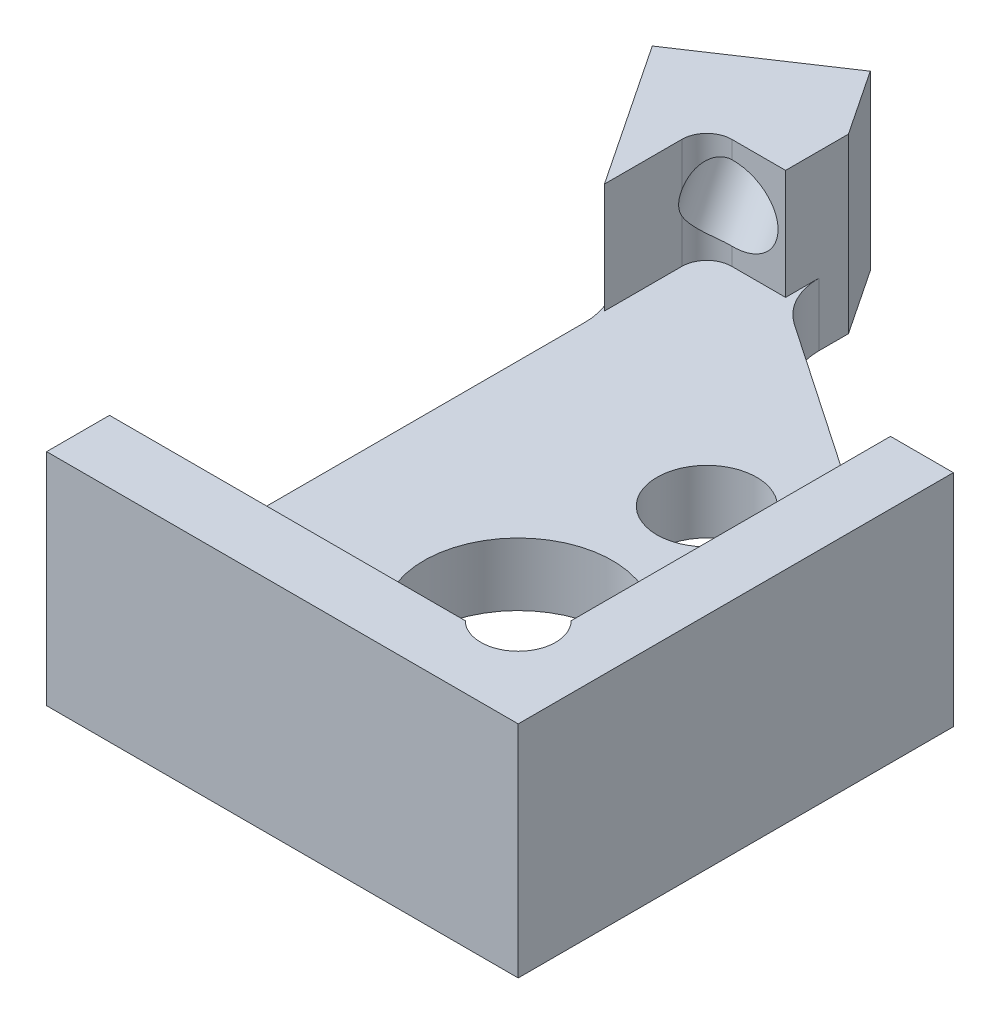
ISO-10303-21;
HEADER;
FILE_DESCRIPTION(('STEP AP214'),'2;1');
FILE_NAME('part.step','',(''),(''),'','','');
FILE_SCHEMA(('AUTOMOTIVE_DESIGN { 1 0 10303 214 1 1 1 1 }'));
ENDSEC;
DATA;
#1=APPLICATION_CONTEXT('core data for automotive mechanical design processes');
#2=APPLICATION_PROTOCOL_DEFINITION('international standard','automotive_design',2000,#1);
#3=PRODUCT_CONTEXT('',#1,'mechanical');
#4=PRODUCT('Part','Part','',(#3));
#5=PRODUCT_RELATED_PRODUCT_CATEGORY('part','',(#4));
#6=PRODUCT_DEFINITION_FORMATION('','',#4);
#7=PRODUCT_DEFINITION_CONTEXT('part definition',#1,'design');
#8=PRODUCT_DEFINITION('design','',#6,#7);
#9=PRODUCT_DEFINITION_SHAPE('','',#8);
#10=(LENGTH_UNIT() NAMED_UNIT(*) SI_UNIT(.MILLI.,.METRE.));
#11=(NAMED_UNIT(*) PLANE_ANGLE_UNIT() SI_UNIT($,.RADIAN.));
#12=(NAMED_UNIT(*) SI_UNIT($,.STERADIAN.) SOLID_ANGLE_UNIT());
#13=UNCERTAINTY_MEASURE_WITH_UNIT(LENGTH_MEASURE(1.E-05),#10,'distance_accuracy_value','');
#14=(GEOMETRIC_REPRESENTATION_CONTEXT(3) GLOBAL_UNCERTAINTY_ASSIGNED_CONTEXT((#13)) GLOBAL_UNIT_ASSIGNED_CONTEXT((#10,
#11,#12)) REPRESENTATION_CONTEXT('',''));
#15=CARTESIAN_POINT('',(0.,0.,0.));
#16=DIRECTION('',(0.,0.,1.));
#17=DIRECTION('',(1.,0.,0.));
#18=AXIS2_PLACEMENT_3D('',#15,#16,#17);
#19=CARTESIAN_POINT('',(4.25,3.5,5.75));
#20=DIRECTION('',(0.,0.,-1.));
#21=DIRECTION('',(-1.,0.,0.));
#22=AXIS2_PLACEMENT_3D('',#19,#20,#21);
#23=PLANE('',#22);
#24=DIRECTION('',(1.,0.,0.));
#25=VECTOR('',#24,1.);
#26=CARTESIAN_POINT('',(4.25,3.5,5.75));
#27=LINE('',#26,#25);
#28=CARTESIAN_POINT('',(-3.25,3.5,5.75));
#29=VERTEX_POINT('',#28);
#30=CARTESIAN_POINT('',(4.25,3.5,5.75));
#31=VERTEX_POINT('',#30);
#32=EDGE_CURVE('E205',#29,#31,#27,.T.);
#33=ORIENTED_EDGE('',*,*,#32,.F.);
#34=DIRECTION('',(0.,1.,0.));
#35=VECTOR('',#34,1.);
#36=CARTESIAN_POINT('',(-3.25,-0.001000000000001,5.75));
#37=LINE('',#36,#35);
#38=CARTESIAN_POINT('',(-3.25,0.,5.75));
#39=VERTEX_POINT('',#38);
#40=EDGE_CURVE('E187',#39,#29,#37,.T.);
#41=ORIENTED_EDGE('',*,*,#40,.F.);
#42=DIRECTION('',(1.,0.,0.));
#43=VECTOR('',#42,1.);
#44=CARTESIAN_POINT('',(4.25,0.,5.75));
#45=LINE('',#44,#43);
#46=CARTESIAN_POINT('',(4.25,0.,5.75));
#47=VERTEX_POINT('',#46);
#48=EDGE_CURVE('E219',#39,#47,#45,.T.);
#49=ORIENTED_EDGE('',*,*,#48,.T.);
#50=DIRECTION('',(0.,-1.,0.));
#51=VECTOR('',#50,1.);
#52=CARTESIAN_POINT('',(4.25,3.5,5.75));
#53=LINE('',#52,#51);
#54=EDGE_CURVE('E212',#31,#47,#53,.T.);
#55=ORIENTED_EDGE('',*,*,#54,.F.);
#56=EDGE_LOOP('',(#33,#41,#49,#55));
#57=FACE_BOUND('',#56,.T.);
#58=ADVANCED_FACE('F35',(#57),#23,.F.);
#59=CARTESIAN_POINT('',(4.25,3.5,-5.75));
#60=DIRECTION('',(-1.,0.,0.));
#61=DIRECTION('',(0.,0.,1.));
#62=AXIS2_PLACEMENT_3D('',#59,#60,#61);
#63=PLANE('',#62);
#64=DIRECTION('',(0.,0.,-1.));
#65=VECTOR('',#64,1.);
#66=CARTESIAN_POINT('',(4.25,0.,-5.75));
#67=LINE('',#66,#65);
#68=CARTESIAN_POINT('',(4.25,0.,-1.17080631760558));
#69=VERTEX_POINT('',#68);
#70=EDGE_CURVE('E215',#47,#69,#67,.T.);
#71=ORIENTED_EDGE('',*,*,#70,.T.);
#72=DIRECTION('',(0.,1.,0.));
#73=VECTOR('',#72,1.);
#74=CARTESIAN_POINT('',(4.25,-0.001000000000001,-1.17080631760558));
#75=LINE('',#74,#73);
#76=CARTESIAN_POINT('',(4.25,3.5,-1.17080631760558));
#77=VERTEX_POINT('',#76);
#78=EDGE_CURVE('E408',#69,#77,#75,.T.);
#79=ORIENTED_EDGE('',*,*,#78,.T.);
#80=DIRECTION('',(0.,0.,-1.));
#81=VECTOR('',#80,1.);
#82=CARTESIAN_POINT('',(4.25,3.5,-5.75));
#83=LINE('',#82,#81);
#84=EDGE_CURVE('E214',#31,#77,#83,.T.);
#85=ORIENTED_EDGE('',*,*,#84,.F.);
#86=ORIENTED_EDGE('',*,*,#54,.T.);
#87=EDGE_LOOP('',(#71,#79,#85,#86));
#88=FACE_BOUND('',#87,.T.);
#89=ADVANCED_FACE('F308',(#88),#63,.F.);
#90=CARTESIAN_POINT('',(0.,3.5,0.));
#91=DIRECTION('',(0.,-1.,0.));
#92=DIRECTION('',(0.,0.,-1.));
#93=AXIS2_PLACEMENT_3D('',#90,#91,#92);
#94=PLANE('',#93);
#95=DIRECTION('',(1.,0.,0.));
#96=VECTOR('',#95,1.);
#97=CARTESIAN_POINT('',(3.25,3.5,4.75));
#98=LINE('',#97,#96);
#99=CARTESIAN_POINT('',(-3.25,3.5,4.75));
#100=VERTEX_POINT('',#99);
#101=CARTESIAN_POINT('',(2.40810098864977,3.5,4.75));
#102=VERTEX_POINT('',#101);
#103=EDGE_CURVE('E209',#100,#102,#98,.T.);
#104=ORIENTED_EDGE('',*,*,#103,.F.);
#105=DIRECTION('',(0.,0.,-1.));
#106=VECTOR('',#105,1.);
#107=CARTESIAN_POINT('',(-3.25,3.5,-3.12166032803723));
#108=LINE('',#107,#106);
#109=EDGE_CURVE('E192',#29,#100,#108,.T.);
#110=ORIENTED_EDGE('',*,*,#109,.F.);
#111=ORIENTED_EDGE('',*,*,#32,.T.);
#112=ORIENTED_EDGE('',*,*,#84,.T.);
#113=DIRECTION('',(1.,0.,0.));
#114=VECTOR('',#113,1.);
#115=CARTESIAN_POINT('',(3.25,3.5,-1.17080631760558));
#116=LINE('',#115,#114);
#117=CARTESIAN_POINT('',(3.25,3.5,-1.17080631760558));
#118=VERTEX_POINT('',#117);
#119=EDGE_CURVE('E406',#118,#77,#116,.T.);
#120=ORIENTED_EDGE('',*,*,#119,.F.);
#121=DIRECTION('',(0.,0.,-1.));
#122=VECTOR('',#121,1.);
#123=CARTESIAN_POINT('',(3.25,3.5,-4.75));
#124=LINE('',#123,#122);
#125=CARTESIAN_POINT('',(3.25,3.5,3.90810098864977));
#126=VERTEX_POINT('',#125);
#127=EDGE_CURVE('E472',#126,#118,#124,.T.);
#128=ORIENTED_EDGE('',*,*,#127,.F.);
#129=CARTESIAN_POINT('',(2.82905049432488,3.5,4.32905049432488));
#130=DIRECTION('',(0.,1.,0.));
#131=DIRECTION('',(0.,0.,1.));
#132=AXIS2_PLACEMENT_3D('',#129,#130,#131);
#133=CIRCLE('',#132,0.595312500000001);
#134=EDGE_CURVE('E457',#102,#126,#133,.T.);
#135=ORIENTED_EDGE('',*,*,#134,.F.);
#136=EDGE_LOOP('',(#104,#110,#111,#112,#120,#128,#135));
#137=FACE_BOUND('',#136,.T.);
#138=ADVANCED_FACE('F203',(#137),#94,.F.);
#139=CARTESIAN_POINT('',(0.,0.,0.));
#140=DIRECTION('',(0.,-1.,0.));
#141=DIRECTION('',(0.,0.,-1.));
#142=AXIS2_PLACEMENT_3D('',#139,#140,#141);
#143=PLANE('',#142);
#144=DIRECTION('',(0.,0.,-1.));
#145=VECTOR('',#144,1.);
#146=CARTESIAN_POINT('',(-3.25,0.,-3.12166032803723));
#147=LINE('',#146,#145);
#148=CARTESIAN_POINT('',(-3.25,0.,-2.81888469030524));
#149=VERTEX_POINT('',#148);
#150=EDGE_CURVE('E195',#39,#149,#147,.T.);
#151=ORIENTED_EDGE('',*,*,#150,.T.);
#152=CARTESIAN_POINT('',(-4.25,0.,-2.81888469030524));
#153=DIRECTION('',(0.,-1.,0.));
#154=DIRECTION('',(0.,0.,-1.));
#155=AXIS2_PLACEMENT_3D('',#152,#153,#154);
#156=CIRCLE('',#155,1.);
#157=CARTESIAN_POINT('',(-3.41794970566216,0.,-3.37358488653047));
#158=VERTEX_POINT('',#157);
#159=EDGE_CURVE('E260',#149,#158,#156,.F.);
#160=ORIENTED_EDGE('',*,*,#159,.T.);
#161=DIRECTION('',(0.55470019622523,0.,0.832050294337843));
#162=VECTOR('',#161,1.);
#163=CARTESIAN_POINT('',(-4.00154138705974,0.,-4.24897240862684));
#164=LINE('',#163,#162);
#165=CARTESIAN_POINT('',(-4.77077215629051,0.,-5.40281856247299));
#166=VERTEX_POINT('',#165);
#167=EDGE_CURVE('E434',#166,#158,#164,.T.);
#168=ORIENTED_EDGE('',*,*,#167,.F.);
#169=DIRECTION('',(-0.832050294337844,0.,0.554700196225229));
#170=VECTOR('',#169,1.);
#171=CARTESIAN_POINT('',(-2.6906464204459,0.,-6.78956905303607));
#172=LINE('',#171,#170);
#173=CARTESIAN_POINT('',(-2.6906464204459,0.,-6.78956905303607));
#174=VERTEX_POINT('',#173);
#175=EDGE_CURVE('E428',#174,#166,#172,.T.);
#176=ORIENTED_EDGE('',*,*,#175,.F.);
#177=DIRECTION('',(-0.554700196225229,0.,-0.832050294337844));
#178=VECTOR('',#177,1.);
#179=CARTESIAN_POINT('',(-2.6906464204459,0.,-6.78956905303607));
#180=LINE('',#179,#178);
#181=CARTESIAN_POINT('',(-1.99760038508853,0.,-5.75));
#182=VERTEX_POINT('',#181);
#183=EDGE_CURVE('E431',#182,#174,#180,.T.);
#184=ORIENTED_EDGE('',*,*,#183,.F.);
#185=DIRECTION('',(0.,0.,1.));
#186=VECTOR('',#185,1.);
#187=CARTESIAN_POINT('',(-1.99760038508852,0.,-5.75));
#188=LINE('',#187,#186);
#189=CARTESIAN_POINT('',(-1.99760038508852,0.,-5.27839559586616));
#190=VERTEX_POINT('',#189);
#191=EDGE_CURVE('E413',#182,#190,#188,.T.);
#192=ORIENTED_EDGE('',*,*,#191,.T.);
#193=CARTESIAN_POINT('',(-0.997600385088525,0.,-5.27839559586616));
#194=DIRECTION('',(0.,-1.,0.));
#195=DIRECTION('',(0.,0.,-1.));
#196=AXIS2_PLACEMENT_3D('',#193,#194,#195);
#197=CIRCLE('',#196,1.);
#198=CARTESIAN_POINT('',(-1.56107522908314,0.,-4.45226237405188));
#199=VERTEX_POINT('',#198);
#200=EDGE_CURVE('E264',#190,#199,#197,.F.);
#201=ORIENTED_EDGE('',*,*,#200,.T.);
#202=DIRECTION('',(0.826133221814283,0.,0.563474843994613));
#203=VECTOR('',#202,1.);
#204=CARTESIAN_POINT('',(-1.99760038508852,0.,-4.75));
#205=LINE('',#204,#203);
#206=CARTESIAN_POINT('',(2.99508689578623,0.,-1.3446730957913));
#207=VERTEX_POINT('',#206);
#208=EDGE_CURVE('E401',#199,#207,#205,.T.);
#209=ORIENTED_EDGE('',*,*,#208,.T.);
#210=CARTESIAN_POINT('',(3.55856173978085,0.,-2.17080631760558));
#211=DIRECTION('',(0.,-1.,0.));
#212=DIRECTION('',(0.,0.,-1.));
#213=AXIS2_PLACEMENT_3D('',#210,#211,#212);
#214=CIRCLE('',#213,1.);
#215=CARTESIAN_POINT('',(3.55856173978085,0.,-1.17080631760558));
#216=VERTEX_POINT('',#215);
#217=EDGE_CURVE('E268',#207,#216,#214,.F.);
#218=ORIENTED_EDGE('',*,*,#217,.T.);
#219=DIRECTION('',(1.,0.,0.));
#220=VECTOR('',#219,1.);
#221=CARTESIAN_POINT('',(3.25,0.,-1.17080631760558));
#222=LINE('',#221,#220);
#223=EDGE_CURVE('E404',#216,#69,#222,.T.);
#224=ORIENTED_EDGE('',*,*,#223,.T.);
#225=ORIENTED_EDGE('',*,*,#70,.F.);
#226=ORIENTED_EDGE('',*,*,#48,.F.);
#227=EDGE_LOOP('',(#151,#160,#168,#176,#184,#192,#201,#209,#218,#224,#225,#226));
#228=FACE_BOUND('',#227,.T.);
#229=CARTESIAN_POINT('',(2.125,0.,3.5));
#230=DIRECTION('',(0.,1.,0.));
#231=DIRECTION('',(0.,0.,1.));
#232=AXIS2_PLACEMENT_3D('',#229,#230,#231);
#233=CIRCLE('',#232,0.79375);
#234=CARTESIAN_POINT('',(2.125,0.,4.29375));
#235=VERTEX_POINT('',#234);
#236=EDGE_CURVE('E442',#235,#235,#233,.T.);
#237=ORIENTED_EDGE('',*,*,#236,.T.);
#238=EDGE_LOOP('',(#237));
#239=FACE_BOUND('',#238,.T.);
#240=CARTESIAN_POINT('',(-1.625,0.,3.5));
#241=DIRECTION('',(0.,1.,0.));
#242=DIRECTION('',(0.,0.,1.));
#243=AXIS2_PLACEMENT_3D('',#240,#241,#242);
#244=CIRCLE('',#243,0.793750000000001);
#245=CARTESIAN_POINT('',(-1.625,0.,4.29375));
#246=VERTEX_POINT('',#245);
#247=EDGE_CURVE('E448',#246,#246,#244,.T.);
#248=ORIENTED_EDGE('',*,*,#247,.T.);
#249=EDGE_LOOP('',(#248));
#250=FACE_BOUND('',#249,.T.);
#251=CARTESIAN_POINT('',(0.250000000000001,0.,-1.25));
#252=DIRECTION('',(0.,1.,0.));
#253=DIRECTION('',(0.,0.,1.));
#254=AXIS2_PLACEMENT_3D('',#251,#252,#253);
#255=CIRCLE('',#254,0.79375);
#256=CARTESIAN_POINT('',(0.250000000000001,0.,-0.456249999999999));
#257=VERTEX_POINT('',#256);
#258=EDGE_CURVE('E454',#257,#257,#255,.T.);
#259=ORIENTED_EDGE('',*,*,#258,.T.);
#260=EDGE_LOOP('',(#259));
#261=FACE_BOUND('',#260,.T.);
#262=CARTESIAN_POINT('',(0.250000000000001,0.,1.75));
#263=DIRECTION('',(0.,1.,0.));
#264=DIRECTION('',(0.,0.,1.));
#265=AXIS2_PLACEMENT_3D('',#262,#263,#264);
#266=CIRCLE('',#265,1.5);
#267=CARTESIAN_POINT('',(0.250000000000001,0.,3.25));
#268=VERTEX_POINT('',#267);
#269=EDGE_CURVE('E467',#268,#268,#266,.T.);
#270=ORIENTED_EDGE('',*,*,#269,.T.);
#271=EDGE_LOOP('',(#270));
#272=FACE_BOUND('',#271,.T.);
#273=ADVANCED_FACE('F312',(#228,#239,#250,#261,#272),#143,.T.);
#274=CARTESIAN_POINT('',(0.,1.,0.));
#275=DIRECTION('',(0.,-1.,0.));
#276=DIRECTION('',(0.,0.,-1.));
#277=AXIS2_PLACEMENT_3D('',#274,#275,#276);
#278=PLANE('',#277);
#279=CARTESIAN_POINT('',(2.125,1.,3.5));
#280=DIRECTION('',(0.,1.,0.));
#281=DIRECTION('',(0.,0.,1.));
#282=AXIS2_PLACEMENT_3D('',#279,#280,#281);
#283=CIRCLE('',#282,0.79375);
#284=CARTESIAN_POINT('',(2.125,1.,4.29375));
#285=VERTEX_POINT('',#284);
#286=EDGE_CURVE('E441',#285,#285,#283,.T.);
#287=ORIENTED_EDGE('',*,*,#286,.F.);
#288=EDGE_LOOP('',(#287));
#289=FACE_BOUND('',#288,.T.);
#290=CARTESIAN_POINT('',(-1.625,1.,3.5));
#291=DIRECTION('',(0.,1.,0.));
#292=DIRECTION('',(0.,0.,1.));
#293=AXIS2_PLACEMENT_3D('',#290,#291,#292);
#294=CIRCLE('',#293,0.793750000000001);
#295=CARTESIAN_POINT('',(-1.625,1.,4.29375));
#296=VERTEX_POINT('',#295);
#297=EDGE_CURVE('E445',#296,#296,#294,.T.);
#298=ORIENTED_EDGE('',*,*,#297,.F.);
#299=EDGE_LOOP('',(#298));
#300=FACE_BOUND('',#299,.T.);
#301=CARTESIAN_POINT('',(0.250000000000001,1.,-1.25));
#302=DIRECTION('',(0.,1.,0.));
#303=DIRECTION('',(0.,0.,1.));
#304=AXIS2_PLACEMENT_3D('',#301,#302,#303);
#305=CIRCLE('',#304,0.79375);
#306=CARTESIAN_POINT('',(0.250000000000001,1.,-0.456249999999999));
#307=VERTEX_POINT('',#306);
#308=EDGE_CURVE('E451',#307,#307,#305,.T.);
#309=ORIENTED_EDGE('',*,*,#308,.F.);
#310=EDGE_LOOP('',(#309));
#311=FACE_BOUND('',#310,.T.);
#312=CARTESIAN_POINT('',(0.250000000000001,1.,1.75));
#313=DIRECTION('',(0.,1.,0.));
#314=DIRECTION('',(0.,0.,1.));
#315=AXIS2_PLACEMENT_3D('',#312,#313,#314);
#316=CIRCLE('',#315,1.5);
#317=CARTESIAN_POINT('',(0.250000000000001,1.,3.25));
#318=VERTEX_POINT('',#317);
#319=EDGE_CURVE('E466',#318,#318,#316,.T.);
#320=ORIENTED_EDGE('',*,*,#319,.F.);
#321=EDGE_LOOP('',(#320));
#322=FACE_BOUND('',#321,.T.);
#323=DIRECTION('',(-1.,0.,0.));
#324=VECTOR('',#323,1.);
#325=CARTESIAN_POINT('',(3.25,1.,-4.75));
#326=LINE('',#325,#324);
#327=CARTESIAN_POINT('',(-1.99760038508852,1.,-4.75));
#328=VERTEX_POINT('',#327);
#329=CARTESIAN_POINT('',(-2.853125,1.,-4.75));
#330=VERTEX_POINT('',#329);
#331=EDGE_CURVE('E482',#328,#330,#326,.T.);
#332=ORIENTED_EDGE('',*,*,#331,.T.);
#333=CARTESIAN_POINT('',(-2.853125,1.,-4.353125));
#334=DIRECTION('',(0.,-1.,0.));
#335=DIRECTION('',(0.,0.,-1.));
#336=AXIS2_PLACEMENT_3D('',#333,#334,#335);
#337=CIRCLE('',#336,0.396875);
#338=CARTESIAN_POINT('',(-3.25,1.,-4.353125));
#339=VERTEX_POINT('',#338);
#340=EDGE_CURVE('E279',#330,#339,#337,.F.);
#341=ORIENTED_EDGE('',*,*,#340,.T.);
#342=DIRECTION('',(0.,0.,1.));
#343=VECTOR('',#342,1.);
#344=CARTESIAN_POINT('',(-3.25,1.,-4.75));
#345=LINE('',#344,#343);
#346=CARTESIAN_POINT('',(-3.25,1.,-3.12166032803723));
#347=VERTEX_POINT('',#346);
#348=EDGE_CURVE('E480',#339,#347,#345,.T.);
#349=ORIENTED_EDGE('',*,*,#348,.T.);
#350=DIRECTION('',(0.55470019622523,0.,0.832050294337843));
#351=VECTOR('',#350,1.);
#352=CARTESIAN_POINT('',(-4.00154138705974,1.,-4.24897240862684));
#353=LINE('',#352,#351);
#354=CARTESIAN_POINT('',(-3.41794970566216,1.,-3.37358488653047));
#355=VERTEX_POINT('',#354);
#356=EDGE_CURVE('E235',#355,#347,#353,.T.);
#357=ORIENTED_EDGE('',*,*,#356,.F.);
#358=CARTESIAN_POINT('',(-4.25,1.,-2.81888469030524));
#359=DIRECTION('',(0.,-1.,0.));
#360=DIRECTION('',(0.,0.,-1.));
#361=AXIS2_PLACEMENT_3D('',#358,#359,#360);
#362=CIRCLE('',#361,1.);
#363=CARTESIAN_POINT('',(-3.25,1.,-2.81888469030524));
#364=VERTEX_POINT('',#363);
#365=EDGE_CURVE('E258',#355,#364,#362,.T.);
#366=ORIENTED_EDGE('',*,*,#365,.T.);
#367=DIRECTION('',(0.,0.,1.));
#368=VECTOR('',#367,1.);
#369=CARTESIAN_POINT('',(-3.25,1.,0.));
#370=LINE('',#369,#368);
#371=CARTESIAN_POINT('',(-3.25,0.999999999999999,4.75));
#372=VERTEX_POINT('',#371);
#373=EDGE_CURVE('E391',#364,#372,#370,.T.);
#374=ORIENTED_EDGE('',*,*,#373,.T.);
#375=DIRECTION('',(1.,0.,0.));
#376=VECTOR('',#375,1.);
#377=CARTESIAN_POINT('',(3.25,1.,4.75));
#378=LINE('',#377,#376);
#379=CARTESIAN_POINT('',(2.40810098864977,1.,4.75));
#380=VERTEX_POINT('',#379);
#381=EDGE_CURVE('E475',#372,#380,#378,.T.);
#382=ORIENTED_EDGE('',*,*,#381,.T.);
#383=CARTESIAN_POINT('',(2.82905049432488,1.,4.32905049432488));
#384=DIRECTION('',(0.,-1.,0.));
#385=DIRECTION('',(0.,0.,-1.));
#386=AXIS2_PLACEMENT_3D('',#383,#384,#385);
#387=CIRCLE('',#386,0.595312500000001);
#388=CARTESIAN_POINT('',(3.25,1.,3.90810098864977));
#389=VERTEX_POINT('',#388);
#390=EDGE_CURVE('E461',#380,#389,#387,.F.);
#391=ORIENTED_EDGE('',*,*,#390,.T.);
#392=DIRECTION('',(0.,0.,-1.));
#393=VECTOR('',#392,1.);
#394=CARTESIAN_POINT('',(3.25,1.,-4.75));
#395=LINE('',#394,#393);
#396=CARTESIAN_POINT('',(3.25,1.,-1.17080631760558));
#397=VERTEX_POINT('',#396);
#398=EDGE_CURVE('E479',#389,#397,#395,.T.);
#399=ORIENTED_EDGE('',*,*,#398,.T.);
#400=DIRECTION('',(-1.,0.,0.));
#401=VECTOR('',#400,1.);
#402=CARTESIAN_POINT('',(0.,1.,-1.17080631760558));
#403=LINE('',#402,#401);
#404=CARTESIAN_POINT('',(3.55856173978085,1.,-1.17080631760558));
#405=VERTEX_POINT('',#404);
#406=EDGE_CURVE('E253',#405,#397,#403,.T.);
#407=ORIENTED_EDGE('',*,*,#406,.F.);
#408=CARTESIAN_POINT('',(3.55856173978085,1.,-2.17080631760558));
#409=DIRECTION('',(0.,-1.,0.));
#410=DIRECTION('',(0.,0.,-1.));
#411=AXIS2_PLACEMENT_3D('',#408,#409,#410);
#412=CIRCLE('',#411,1.);
#413=CARTESIAN_POINT('',(2.99508689578623,1.,-1.3446730957913));
#414=VERTEX_POINT('',#413);
#415=EDGE_CURVE('E266',#405,#414,#412,.T.);
#416=ORIENTED_EDGE('',*,*,#415,.T.);
#417=DIRECTION('',(0.826133221814283,0.,0.563474843994613));
#418=VECTOR('',#417,1.);
#419=CARTESIAN_POINT('',(-1.99760038508852,1.,-4.75));
#420=LINE('',#419,#418);
#421=CARTESIAN_POINT('',(-1.56107522908314,1.,-4.45226237405188));
#422=VERTEX_POINT('',#421);
#423=EDGE_CURVE('E416',#422,#414,#420,.T.);
#424=ORIENTED_EDGE('',*,*,#423,.F.);
#425=CARTESIAN_POINT('',(-0.997600385088525,1.,-5.27839559586616));
#426=DIRECTION('',(0.,-1.,0.));
#427=DIRECTION('',(0.,0.,-1.));
#428=AXIS2_PLACEMENT_3D('',#425,#426,#427);
#429=CIRCLE('',#428,1.);
#430=CARTESIAN_POINT('',(-1.99760038508852,1.,-5.27839559586616));
#431=VERTEX_POINT('',#430);
#432=EDGE_CURVE('E262',#422,#431,#429,.T.);
#433=ORIENTED_EDGE('',*,*,#432,.T.);
#434=DIRECTION('',(0.,0.,-1.));
#435=VECTOR('',#434,1.);
#436=CARTESIAN_POINT('',(-1.99760038508852,1.,0.));
#437=LINE('',#436,#435);
#438=EDGE_CURVE('E250',#328,#431,#437,.T.);
#439=ORIENTED_EDGE('',*,*,#438,.F.);
#440=EDGE_LOOP('',(#332,#341,#349,#357,#366,#374,#382,#391,#399,#407,#416,#424,#433,#439));
#441=FACE_BOUND('',#440,.T.);
#442=ADVANCED_FACE('F315',(#289,#300,#311,#322,#441),#278,.F.);
#443=CARTESIAN_POINT('',(3.25,-11.5108644332213,4.75));
#444=DIRECTION('',(0.,0.,1.));
#445=DIRECTION('',(1.,0.,0.));
#446=AXIS2_PLACEMENT_3D('',#443,#444,#445);
#447=PLANE('',#446);
#448=ORIENTED_EDGE('',*,*,#103,.T.);
#449=DIRECTION('',(0.,1.,0.));
#450=VECTOR('',#449,1.);
#451=CARTESIAN_POINT('',(2.40810098864977,-0.68379802270047,4.75));
#452=LINE('',#451,#450);
#453=EDGE_CURVE('E463',#102,#380,#452,.F.);
#454=ORIENTED_EDGE('',*,*,#453,.T.);
#455=ORIENTED_EDGE('',*,*,#381,.F.);
#456=DIRECTION('',(0.,1.,0.));
#457=VECTOR('',#456,1.);
#458=CARTESIAN_POINT('',(-3.25,-11.5108644332213,4.75));
#459=LINE('',#458,#457);
#460=EDGE_CURVE('E222',#372,#100,#459,.T.);
#461=ORIENTED_EDGE('',*,*,#460,.T.);
#462=EDGE_LOOP('',(#448,#454,#455,#461));
#463=FACE_BOUND('',#462,.T.);
#464=ADVANCED_FACE('F321',(#463),#447,.F.);
#465=CARTESIAN_POINT('',(3.25,-11.5108644332213,-4.75));
#466=DIRECTION('',(1.,0.,0.));
#467=DIRECTION('',(0.,0.,-1.));
#468=AXIS2_PLACEMENT_3D('',#465,#466,#467);
#469=PLANE('',#468);
#470=ORIENTED_EDGE('',*,*,#127,.T.);
#471=DIRECTION('',(0.,1.,0.));
#472=VECTOR('',#471,1.);
#473=CARTESIAN_POINT('',(3.25,-0.001000000000001,-1.17080631760558));
#474=LINE('',#473,#472);
#475=EDGE_CURVE('E399',#397,#118,#474,.T.);
#476=ORIENTED_EDGE('',*,*,#475,.F.);
#477=ORIENTED_EDGE('',*,*,#398,.F.);
#478=DIRECTION('',(0.,1.,0.));
#479=VECTOR('',#478,1.);
#480=CARTESIAN_POINT('',(3.25,-0.68379802270047,3.90810098864977));
#481=LINE('',#480,#479);
#482=EDGE_CURVE('E227',#389,#126,#481,.T.);
#483=ORIENTED_EDGE('',*,*,#482,.T.);
#484=EDGE_LOOP('',(#470,#476,#477,#483));
#485=FACE_BOUND('',#484,.T.);
#486=ADVANCED_FACE('F325',(#485),#469,.F.);
#487=CARTESIAN_POINT('',(3.25,-11.5108644332213,-4.75));
#488=DIRECTION('',(0.,0.,-1.));
#489=DIRECTION('',(-1.,0.,0.));
#490=AXIS2_PLACEMENT_3D('',#487,#488,#489);
#491=PLANE('',#490);
#492=DIRECTION('',(-1.,0.,0.));
#493=VECTOR('',#492,1.);
#494=CARTESIAN_POINT('',(3.25,2.75,-4.75));
#495=LINE('',#494,#493);
#496=CARTESIAN_POINT('',(-1.99760038508852,2.75,-4.75));
#497=VERTEX_POINT('',#496);
#498=CARTESIAN_POINT('',(-2.853125,2.75,-4.75));
#499=VERTEX_POINT('',#498);
#500=EDGE_CURVE('E426',#497,#499,#495,.T.);
#501=ORIENTED_EDGE('',*,*,#500,.T.);
#502=DIRECTION('',(0.,1.,0.));
#503=VECTOR('',#502,1.);
#504=CARTESIAN_POINT('',(-2.853125,2.35928589904809,-4.75));
#505=LINE('',#504,#503);
#506=CARTESIAN_POINT('',(-2.853125,2.47040031499463,-4.75));
#507=VERTEX_POINT('',#506);
#508=EDGE_CURVE('E60',#499,#507,#505,.F.);
#509=ORIENTED_EDGE('',*,*,#508,.T.);
#510=CARTESIAN_POINT('',(-2.83324674986519,1.875,-4.75));
#511=DIRECTION('',(0.,0.,-1.));
#512=DIRECTION('',(-1.,0.,0.));
#513=AXIS2_PLACEMENT_3D('',#510,#511,#512);
#514=ELLIPSE('',#513,0.715858168734871,0.595629999999999);
#515=CARTESIAN_POINT('',(-2.853125,1.27959968500537,-4.75));
#516=VERTEX_POINT('',#515);
#517=EDGE_CURVE('E422',#507,#516,#514,.T.);
#518=ORIENTED_EDGE('',*,*,#517,.T.);
#519=DIRECTION('',(0.,1.,0.));
#520=VECTOR('',#519,1.);
#521=CARTESIAN_POINT('',(-2.853125,1.,-4.75));
#522=LINE('',#521,#520);
#523=EDGE_CURVE('E276',#516,#330,#522,.F.);
#524=ORIENTED_EDGE('',*,*,#523,.T.);
#525=ORIENTED_EDGE('',*,*,#331,.F.);
#526=DIRECTION('',(0.,-1.,0.));
#527=VECTOR('',#526,1.);
#528=CARTESIAN_POINT('',(-1.99760038508852,-0.001000000000001,-4.75));
#529=LINE('',#528,#527);
#530=EDGE_CURVE('E393',#497,#328,#529,.T.);
#531=ORIENTED_EDGE('',*,*,#530,.F.);
#532=EDGE_LOOP('',(#501,#509,#518,#524,#525,#531));
#533=FACE_BOUND('',#532,.T.);
#534=ADVANCED_FACE('F329',(#533),#491,.F.);
#535=CARTESIAN_POINT('',(-3.25,-11.5108644332213,-4.75));
#536=DIRECTION('',(-1.,0.,0.));
#537=DIRECTION('',(0.,0.,1.));
#538=AXIS2_PLACEMENT_3D('',#535,#536,#537);
#539=PLANE('',#538);
#540=CARTESIAN_POINT('',(-3.25,1.875,-5.37512987520222));
#541=DIRECTION('',(-1.,0.,0.));
#542=DIRECTION('',(0.,0.,-1.));
#543=AXIS2_PLACEMENT_3D('',#540,#541,#542);
#544=ELLIPSE('',#543,1.0737872531023,0.595629999999999);
#545=CARTESIAN_POINT('',(-3.25,1.69226429342405,-4.353125));
#546=VERTEX_POINT('',#545);
#547=CARTESIAN_POINT('',(-3.25,2.05773570657595,-4.353125));
#548=VERTEX_POINT('',#547);
#549=EDGE_CURVE('E232',#546,#548,#544,.T.);
#550=ORIENTED_EDGE('',*,*,#549,.T.);
#551=DIRECTION('',(0.,1.,0.));
#552=VECTOR('',#551,1.);
#553=CARTESIAN_POINT('',(-3.25,2.75,-4.353125));
#554=LINE('',#553,#552);
#555=CARTESIAN_POINT('',(-3.25,2.75,-4.353125));
#556=VERTEX_POINT('',#555);
#557=EDGE_CURVE('E273',#548,#556,#554,.T.);
#558=ORIENTED_EDGE('',*,*,#557,.T.);
#559=DIRECTION('',(0.,0.,1.));
#560=VECTOR('',#559,1.);
#561=CARTESIAN_POINT('',(-3.25,2.75,-4.75));
#562=LINE('',#561,#560);
#563=CARTESIAN_POINT('',(-3.25,2.75,-3.12166032803723));
#564=VERTEX_POINT('',#563);
#565=EDGE_CURVE('E381',#556,#564,#562,.T.);
#566=ORIENTED_EDGE('',*,*,#565,.T.);
#567=DIRECTION('',(0.,1.,0.));
#568=VECTOR('',#567,1.);
#569=CARTESIAN_POINT('',(-3.25,-0.001000000000001,-3.12166032803723));
#570=LINE('',#569,#568);
#571=EDGE_CURVE('E199',#347,#564,#570,.T.);
#572=ORIENTED_EDGE('',*,*,#571,.F.);
#573=ORIENTED_EDGE('',*,*,#348,.F.);
#574=DIRECTION('',(0.,1.,0.));
#575=VECTOR('',#574,1.);
#576=CARTESIAN_POINT('',(-3.25,1.39071410095191,-4.353125));
#577=LINE('',#576,#575);
#578=EDGE_CURVE('E270',#339,#546,#577,.T.);
#579=ORIENTED_EDGE('',*,*,#578,.T.);
#580=EDGE_LOOP('',(#550,#558,#566,#572,#573,#579));
#581=FACE_BOUND('',#580,.T.);
#582=ADVANCED_FACE('F333',(#581),#539,.F.);
#583=CARTESIAN_POINT('',(0.250000000000001,0.,1.75));
#584=DIRECTION('',(0.,1.,0.));
#585=DIRECTION('',(0.,0.,1.));
#586=AXIS2_PLACEMENT_3D('',#583,#584,#585);
#587=CYLINDRICAL_SURFACE('',#586,1.5);
#588=ORIENTED_EDGE('',*,*,#269,.F.);
#589=EDGE_LOOP('',(#588));
#590=FACE_BOUND('',#589,.T.);
#591=ORIENTED_EDGE('',*,*,#319,.T.);
#592=EDGE_LOOP('',(#591));
#593=FACE_BOUND('',#592,.T.);
#594=ADVANCED_FACE('F336',(#590,#593),#587,.F.);
#595=CARTESIAN_POINT('',(2.82905049432488,-0.68379802270047,4.32905049432488));
#596=DIRECTION('',(0.,1.,0.));
#597=DIRECTION('',(0.,0.,1.));
#598=AXIS2_PLACEMENT_3D('',#595,#596,#597);
#599=CYLINDRICAL_SURFACE('',#598,0.595312500000001);
#600=ORIENTED_EDGE('',*,*,#134,.T.);
#601=ORIENTED_EDGE('',*,*,#482,.F.);
#602=ORIENTED_EDGE('',*,*,#390,.F.);
#603=ORIENTED_EDGE('',*,*,#453,.F.);
#604=EDGE_LOOP('',(#600,#601,#602,#603));
#605=FACE_BOUND('',#604,.T.);
#606=ADVANCED_FACE('F340',(#605),#599,.F.);
#607=CARTESIAN_POINT('',(0.250000000000001,0.,-1.25));
#608=DIRECTION('',(0.,1.,0.));
#609=DIRECTION('',(0.,0.,1.));
#610=AXIS2_PLACEMENT_3D('',#607,#608,#609);
#611=CYLINDRICAL_SURFACE('',#610,0.79375);
#612=ORIENTED_EDGE('',*,*,#258,.F.);
#613=EDGE_LOOP('',(#612));
#614=FACE_BOUND('',#613,.T.);
#615=ORIENTED_EDGE('',*,*,#308,.T.);
#616=EDGE_LOOP('',(#615));
#617=FACE_BOUND('',#616,.T.);
#618=ADVANCED_FACE('F344',(#614,#617),#611,.F.);
#619=CARTESIAN_POINT('',(-1.625,0.,3.5));
#620=DIRECTION('',(0.,1.,0.));
#621=DIRECTION('',(0.,0.,1.));
#622=AXIS2_PLACEMENT_3D('',#619,#620,#621);
#623=CYLINDRICAL_SURFACE('',#622,0.793750000000001);
#624=ORIENTED_EDGE('',*,*,#247,.F.);
#625=EDGE_LOOP('',(#624));
#626=FACE_BOUND('',#625,.T.);
#627=ORIENTED_EDGE('',*,*,#297,.T.);
#628=EDGE_LOOP('',(#627));
#629=FACE_BOUND('',#628,.T.);
#630=ADVANCED_FACE('F348',(#626,#629),#623,.F.);
#631=CARTESIAN_POINT('',(2.125,0.,3.5));
#632=DIRECTION('',(0.,1.,0.));
#633=DIRECTION('',(0.,0.,1.));
#634=AXIS2_PLACEMENT_3D('',#631,#632,#633);
#635=CYLINDRICAL_SURFACE('',#634,0.79375);
#636=ORIENTED_EDGE('',*,*,#236,.F.);
#637=EDGE_LOOP('',(#636));
#638=FACE_BOUND('',#637,.T.);
#639=ORIENTED_EDGE('',*,*,#286,.T.);
#640=EDGE_LOOP('',(#639));
#641=FACE_BOUND('',#640,.T.);
#642=ADVANCED_FACE('F352',(#638,#641),#635,.F.);
#643=CARTESIAN_POINT('',(-2.6906464204459,-3.81752063551709,-6.78956905303607));
#644=DIRECTION('',(-0.554700196225229,0.,-0.832050294337843));
#645=DIRECTION('',(-0.832050294337844,0.,0.554700196225229));
#646=AXIS2_PLACEMENT_3D('',#643,#644,#645);
#647=PLANE('',#646);
#648=CARTESIAN_POINT('',(-3.73070928836821,1.875,-6.09619380775453));
#649=DIRECTION('',(-0.55470019622523,0.,-0.832050294337843));
#650=DIRECTION('',(-0.832050294337843,0.,0.55470019622523));
#651=AXIS2_PLACEMENT_3D('',#648,#649,#650);
#652=CIRCLE('',#651,0.595629999999999);
#653=CARTESIAN_POINT('',(-4.22630340518466,1.875,-5.7657977298769));
#654=VERTEX_POINT('',#653);
#655=EDGE_CURVE('E419',#654,#654,#652,.T.);
#656=ORIENTED_EDGE('',*,*,#655,.F.);
#657=EDGE_LOOP('',(#656));
#658=FACE_BOUND('',#657,.T.);
#659=DIRECTION('',(-0.832050294337844,0.,0.554700196225229));
#660=VECTOR('',#659,1.);
#661=CARTESIAN_POINT('',(-2.6906464204459,2.75,-6.78956905303607));
#662=LINE('',#661,#660);
#663=CARTESIAN_POINT('',(-2.6906464204459,2.75,-6.78956905303607));
#664=VERTEX_POINT('',#663);
#665=CARTESIAN_POINT('',(-4.77077215629051,2.75,-5.40281856247299));
#666=VERTEX_POINT('',#665);
#667=EDGE_CURVE('E383',#664,#666,#662,.T.);
#668=ORIENTED_EDGE('',*,*,#667,.F.);
#669=DIRECTION('',(0.,1.,0.));
#670=VECTOR('',#669,1.);
#671=CARTESIAN_POINT('',(-2.6906464204459,-3.81752063551709,-6.78956905303607));
#672=LINE('',#671,#670);
#673=EDGE_CURVE('E433',#174,#664,#672,.T.);
#674=ORIENTED_EDGE('',*,*,#673,.F.);
#675=ORIENTED_EDGE('',*,*,#175,.T.);
#676=DIRECTION('',(0.,1.,0.));
#677=VECTOR('',#676,1.);
#678=CARTESIAN_POINT('',(-4.77077215629051,-3.81752063551709,-5.40281856247299));
#679=LINE('',#678,#677);
#680=EDGE_CURVE('E430',#166,#666,#679,.T.);
#681=ORIENTED_EDGE('',*,*,#680,.T.);
#682=EDGE_LOOP('',(#668,#674,#675,#681));
#683=FACE_BOUND('',#682,.T.);
#684=ADVANCED_FACE('F356',(#658,#683),#647,.T.);
#685=CARTESIAN_POINT('',(-4.00154138705974,-3.81752063551709,-4.24897240862684));
#686=DIRECTION('',(-0.832050294337843,0.,0.55470019622523));
#687=DIRECTION('',(0.55470019622523,0.,0.832050294337843));
#688=AXIS2_PLACEMENT_3D('',#685,#686,#687);
#689=PLANE('',#688);
#690=ORIENTED_EDGE('',*,*,#167,.T.);
#691=DIRECTION('',(0.,1.,0.));
#692=VECTOR('',#691,1.);
#693=CARTESIAN_POINT('',(-3.41794970566216,-3.81752063551709,-3.37358488653047));
#694=LINE('',#693,#692);
#695=EDGE_CURVE('E238',#158,#355,#694,.T.);
#696=ORIENTED_EDGE('',*,*,#695,.T.);
#697=ORIENTED_EDGE('',*,*,#356,.T.);
#698=ORIENTED_EDGE('',*,*,#571,.T.);
#699=DIRECTION('',(0.55470019622523,0.,0.832050294337843));
#700=VECTOR('',#699,1.);
#701=CARTESIAN_POINT('',(-4.00154138705974,2.75,-4.24897240862684));
#702=LINE('',#701,#700);
#703=EDGE_CURVE('E379',#666,#564,#702,.T.);
#704=ORIENTED_EDGE('',*,*,#703,.F.);
#705=ORIENTED_EDGE('',*,*,#680,.F.);
#706=EDGE_LOOP('',(#690,#696,#697,#698,#704,#705));
#707=FACE_BOUND('',#706,.T.);
#708=ADVANCED_FACE('F360',(#707),#689,.T.);
#709=CARTESIAN_POINT('',(-2.6906464204459,-3.81752063551709,-6.78956905303607));
#710=DIRECTION('',(0.832050294337844,0.,-0.554700196225229));
#711=DIRECTION('',(-0.554700196225229,0.,-0.832050294337844));
#712=AXIS2_PLACEMENT_3D('',#709,#710,#711);
#713=PLANE('',#712);
#714=DIRECTION('',(-0.554700196225229,0.,-0.832050294337844));
#715=VECTOR('',#714,1.);
#716=CARTESIAN_POINT('',(-2.6906464204459,2.75,-6.78956905303607));
#717=LINE('',#716,#715);
#718=CARTESIAN_POINT('',(-1.99760038508853,2.75,-5.75));
#719=VERTEX_POINT('',#718);
#720=EDGE_CURVE('E230',#719,#664,#717,.T.);
#721=ORIENTED_EDGE('',*,*,#720,.F.);
#722=DIRECTION('',(0.,1.,0.));
#723=VECTOR('',#722,1.);
#724=CARTESIAN_POINT('',(-1.99760038508853,3.5,-5.75));
#725=LINE('',#724,#723);
#726=EDGE_CURVE('E439',#182,#719,#725,.T.);
#727=ORIENTED_EDGE('',*,*,#726,.F.);
#728=ORIENTED_EDGE('',*,*,#183,.T.);
#729=ORIENTED_EDGE('',*,*,#673,.T.);
#730=EDGE_LOOP('',(#721,#727,#728,#729));
#731=FACE_BOUND('',#730,.T.);
#732=ADVANCED_FACE('F364',(#731),#713,.T.);
#733=CARTESIAN_POINT('',(0.,2.75,0.));
#734=DIRECTION('',(0.,-1.,0.));
#735=DIRECTION('',(0.,0.,-1.));
#736=AXIS2_PLACEMENT_3D('',#733,#734,#735);
#737=PLANE('',#736);
#738=ORIENTED_EDGE('',*,*,#703,.T.);
#739=ORIENTED_EDGE('',*,*,#565,.F.);
#740=CARTESIAN_POINT('',(-2.853125,2.75,-4.353125));
#741=DIRECTION('',(0.,-1.,0.));
#742=DIRECTION('',(0.,0.,-1.));
#743=AXIS2_PLACEMENT_3D('',#740,#741,#742);
#744=CIRCLE('',#743,0.396875);
#745=EDGE_CURVE('E281',#556,#499,#744,.T.);
#746=ORIENTED_EDGE('',*,*,#745,.T.);
#747=ORIENTED_EDGE('',*,*,#500,.F.);
#748=DIRECTION('',(0.,0.,1.));
#749=VECTOR('',#748,1.);
#750=CARTESIAN_POINT('',(-1.99760038508852,2.75,-5.75));
#751=LINE('',#750,#749);
#752=EDGE_CURVE('E411',#719,#497,#751,.T.);
#753=ORIENTED_EDGE('',*,*,#752,.F.);
#754=ORIENTED_EDGE('',*,*,#720,.T.);
#755=ORIENTED_EDGE('',*,*,#667,.T.);
#756=EDGE_LOOP('',(#738,#739,#746,#747,#753,#754,#755));
#757=FACE_BOUND('',#756,.T.);
#758=ADVANCED_FACE('F367',(#757),#737,.F.);
#759=CARTESIAN_POINT('',(-3.73070928836821,1.875,-6.09619380775453));
#760=DIRECTION('',(-0.55470019622523,0.,-0.832050294337843));
#761=DIRECTION('',(-0.832050294337843,0.,0.55470019622523));
#762=AXIS2_PLACEMENT_3D('',#759,#760,#761);
#763=CYLINDRICAL_SURFACE('',#762,0.595629999999999);
#764=ORIENTED_EDGE('',*,*,#655,.T.);
#765=EDGE_LOOP('',(#764));
#766=FACE_BOUND('',#765,.T.);
#767=ORIENTED_EDGE('',*,*,#549,.F.);
#768=CARTESIAN_POINT('',(-3.25,1.69226429342405,-4.353125));
#769=CARTESIAN_POINT('',(-3.25000530404781,1.67784667721635,-4.36152249887755));
#770=CARTESIAN_POINT('',(-3.2497336385688,1.66372633133309,-4.37040368449734));
#771=CARTESIAN_POINT('',(-3.24848970397273,1.6360183531278,-4.38892443448311));
#772=CARTESIAN_POINT('',(-3.24751727444539,1.62243084352711,-4.39856417203733));
#773=CARTESIAN_POINT('',(-3.24330698093827,1.58217509955724,-4.42845687272454));
#774=CARTESIAN_POINT('',(-3.23877132320597,1.55623805374229,-4.44954502718479));
#775=CARTESIAN_POINT('',(-3.22591952619256,1.5086907603516,-4.49082097785133));
#776=CARTESIAN_POINT('',(-3.21798063779436,1.48690121107721,-4.51091882292746));
#777=CARTESIAN_POINT('',(-3.19780764707909,1.44549009443437,-4.55113238183201));
#778=CARTESIAN_POINT('',(-3.18558767584682,1.42586167036459,-4.5712478222963));
#779=CARTESIAN_POINT('',(-3.15984068605246,1.39385203539347,-4.60566742866553));
#780=CARTESIAN_POINT('',(-3.14735992496922,1.38087104132752,-4.62019205750861));
#781=CARTESIAN_POINT('',(-3.11945834850653,1.35689134388393,-4.64802081907591));
#782=CARTESIAN_POINT('',(-3.10403995456957,1.3458910222952,-4.66132594373221));
#783=CARTESIAN_POINT('',(-3.07017394822283,1.326174299334,-4.68605498729532));
#784=CARTESIAN_POINT('',(-3.05169978155415,1.31747983245731,-4.69746048034918));
#785=CARTESIAN_POINT('',(-3.01225438383063,1.3028061693935,-4.71737034996803));
#786=CARTESIAN_POINT('',(-2.99128384788774,1.29682621957324,-4.72587553158504));
#787=CARTESIAN_POINT('',(-2.95092814397122,1.28828964233071,-4.73824837502081));
#788=CARTESIAN_POINT('',(-2.93177367432129,1.28535522631387,-4.74261881155494));
#789=CARTESIAN_POINT('',(-2.89279320418391,1.28122452356466,-4.74851348279176));
#790=CARTESIAN_POINT('',(-2.8729654963279,1.2800330559713,-4.75002982942309));
#791=CARTESIAN_POINT('',(-2.853125,1.27959968500537,-4.75));
#792=B_SPLINE_CURVE_WITH_KNOTS('',3,(#768,#769,#770,#771,#772,#773,#774,#775,#776,#777,#778,
#779,#780,#781,#782,#783,#784,#785,#786,#787,#788,#789,#790,#791),.UNSPECIFIED.,.F.,.F.,(4,2,2,
2,2,2,2,2,2,2,2,4),(0.,0.0500199707843349,0.100051395163274,0.20089895899066,0.292664347279268,
0.384129644898978,0.45327980378631,0.522373208019127,0.592102031538382,0.661811484341184,
0.721114057628572,0.780580290771908),.UNSPECIFIED.);
#793=EDGE_CURVE('E12',#546,#516,#792,.T.);
#794=ORIENTED_EDGE('',*,*,#793,.T.);
#795=ORIENTED_EDGE('',*,*,#517,.F.);
#796=CARTESIAN_POINT('',(-2.853125,2.47040031499463,-4.75));
#797=CARTESIAN_POINT('',(-2.87258531054631,2.46997559711788,-4.75002977627681));
#798=CARTESIAN_POINT('',(-2.89203843772288,2.46882039673611,-4.74857045760153));
#799=CARTESIAN_POINT('',(-2.9303101248076,2.46483207865026,-4.7428930296803));
#800=CARTESIAN_POINT('',(-2.9491301439954,2.46200314555431,-4.73868179793703));
#801=CARTESIAN_POINT('',(-2.98564994699716,2.45444387785414,-4.72770836467614));
#802=CARTESIAN_POINT('',(-3.00334771150844,2.44971022246041,-4.72094170917596));
#803=CARTESIAN_POINT('',(-3.03709647517311,2.43833417854192,-4.70527586709555));
#804=CARTESIAN_POINT('',(-3.05314767323186,2.43169202093371,-4.69637693852833));
#805=CARTESIAN_POINT('',(-3.08331128939731,2.41662025737261,-4.67692576757584));
#806=CARTESIAN_POINT('',(-3.09742096959836,2.40818816900771,-4.6663712344346));
#807=CARTESIAN_POINT('',(-3.12354680428583,2.3897667463697,-4.64411768848085));
#808=CARTESIAN_POINT('',(-3.13556253455194,2.37977709732008,-4.63241844450546));
#809=CARTESIAN_POINT('',(-3.16257343476563,2.35357523745291,-4.60276087045942));
#810=CARTESIAN_POINT('',(-3.1763983832167,2.33661380959828,-4.5843979366654));
#811=CARTESIAN_POINT('',(-3.20005295479663,2.30046303608181,-4.54713932870473));
#812=CARTESIAN_POINT('',(-3.20986009776211,2.28126190681512,-4.52824127296198));
#813=CARTESIAN_POINT('',(-3.22401847401116,2.24592206886647,-4.49521412555765));
#814=CARTESIAN_POINT('',(-3.22911170903627,2.23013464790932,-4.48101528493794));
#815=CARTESIAN_POINT('',(-3.23748406178731,2.19767044774062,-4.45307977638128));
#816=CARTESIAN_POINT('',(-3.24076145365244,2.18099283889868,-4.43934355974694));
#817=CARTESIAN_POINT('',(-3.24571248601741,2.14704191407568,-4.41281646953929));
#818=CARTESIAN_POINT('',(-3.24740705504968,2.12977959360841,-4.40001538466137));
#819=CARTESIAN_POINT('',(-3.24955693558387,2.09441235599405,-4.3755919275937));
#820=CARTESIAN_POINT('',(-3.25001437113964,2.0763089373862,-4.36396756814816));
#821=CARTESIAN_POINT('',(-3.25,2.05773570657595,-4.353125));
#822=B_SPLINE_CURVE_WITH_KNOTS('',3,(#796,#797,#798,#799,#800,#801,#802,#803,#804,#805,#806,
#807,#808,#809,#810,#811,#812,#813,#814,#815,#816,#817,#818,#819,#820,#821),.UNSPECIFIED.,.F.,
.F.,(4,2,2,2,2,2,2,2,2,2,2,2,4),(0.,0.0583397692179043,0.116534292104676,0.174830716953855,
0.233120091276853,0.291490840152367,0.349873400839598,0.435099175955516,0.52079549424467,
0.586202047972592,0.651670660918354,0.716260839029197,0.780740050640298),.UNSPECIFIED.);
#823=EDGE_CURVE('E48',#507,#548,#822,.T.);
#824=ORIENTED_EDGE('',*,*,#823,.T.);
#825=EDGE_LOOP('',(#767,#794,#795,#824));
#826=FACE_BOUND('',#825,.T.);
#827=ADVANCED_FACE('F285',(#766,#826),#763,.F.);
#828=CARTESIAN_POINT('',(-1.99760038508852,-0.001000000000001,-4.75));
#829=DIRECTION('',(-0.563474843994613,0.,0.826133221814283));
#830=DIRECTION('',(0.826133221814283,0.,0.563474843994613));
#831=AXIS2_PLACEMENT_3D('',#828,#829,#830);
#832=PLANE('',#831);
#833=ORIENTED_EDGE('',*,*,#208,.F.);
#834=DIRECTION('',(0.,1.,0.));
#835=VECTOR('',#834,1.);
#836=CARTESIAN_POINT('',(-1.56107522908314,1.,-4.45226237405188));
#837=LINE('',#836,#835);
#838=EDGE_CURVE('E245',#199,#422,#837,.T.);
#839=ORIENTED_EDGE('',*,*,#838,.T.);
#840=ORIENTED_EDGE('',*,*,#423,.T.);
#841=DIRECTION('',(0.,1.,0.));
#842=VECTOR('',#841,1.);
#843=CARTESIAN_POINT('',(2.99508689578623,0.,-1.3446730957913));
#844=LINE('',#843,#842);
#845=EDGE_CURVE('E243',#414,#207,#844,.F.);
#846=ORIENTED_EDGE('',*,*,#845,.T.);
#847=EDGE_LOOP('',(#833,#839,#840,#846));
#848=FACE_BOUND('',#847,.T.);
#849=ADVANCED_FACE('F374',(#848),#832,.F.);
#850=CARTESIAN_POINT('',(-1.99760038508852,-0.001000000000001,-5.75));
#851=DIRECTION('',(-1.,0.,0.));
#852=DIRECTION('',(0.,0.,1.));
#853=AXIS2_PLACEMENT_3D('',#850,#851,#852);
#854=PLANE('',#853);
#855=ORIENTED_EDGE('',*,*,#530,.T.);
#856=ORIENTED_EDGE('',*,*,#438,.T.);
#857=DIRECTION('',(0.,1.,0.));
#858=VECTOR('',#857,1.);
#859=CARTESIAN_POINT('',(-1.99760038508852,0.,-5.27839559586616));
#860=LINE('',#859,#858);
#861=EDGE_CURVE('E248',#431,#190,#860,.F.);
#862=ORIENTED_EDGE('',*,*,#861,.T.);
#863=ORIENTED_EDGE('',*,*,#191,.F.);
#864=ORIENTED_EDGE('',*,*,#726,.T.);
#865=ORIENTED_EDGE('',*,*,#752,.T.);
#866=EDGE_LOOP('',(#855,#856,#862,#863,#864,#865));
#867=FACE_BOUND('',#866,.T.);
#868=ADVANCED_FACE('F507',(#867),#854,.F.);
#869=CARTESIAN_POINT('',(3.25,-0.001000000000001,-1.17080631760558));
#870=DIRECTION('',(0.,0.,1.));
#871=DIRECTION('',(1.,0.,0.));
#872=AXIS2_PLACEMENT_3D('',#869,#870,#871);
#873=PLANE('',#872);
#874=ORIENTED_EDGE('',*,*,#223,.F.);
#875=DIRECTION('',(0.,1.,0.));
#876=VECTOR('',#875,1.);
#877=CARTESIAN_POINT('',(3.55856173978085,1.,-1.17080631760558));
#878=LINE('',#877,#876);
#879=EDGE_CURVE('E255',#216,#405,#878,.T.);
#880=ORIENTED_EDGE('',*,*,#879,.T.);
#881=ORIENTED_EDGE('',*,*,#406,.T.);
#882=ORIENTED_EDGE('',*,*,#475,.T.);
#883=ORIENTED_EDGE('',*,*,#119,.T.);
#884=ORIENTED_EDGE('',*,*,#78,.F.);
#885=EDGE_LOOP('',(#874,#880,#881,#882,#883,#884));
#886=FACE_BOUND('',#885,.T.);
#887=ADVANCED_FACE('F494',(#886),#873,.F.);
#888=CARTESIAN_POINT('',(-3.25,-0.001000000000001,-3.12166032803723));
#889=DIRECTION('',(1.,0.,0.));
#890=DIRECTION('',(0.,0.,-1.));
#891=AXIS2_PLACEMENT_3D('',#888,#889,#890);
#892=PLANE('',#891);
#893=ORIENTED_EDGE('',*,*,#373,.F.);
#894=DIRECTION('',(0.,1.,0.));
#895=VECTOR('',#894,1.);
#896=CARTESIAN_POINT('',(-3.25,-0.001000000000001,-2.81888469030524));
#897=LINE('',#896,#895);
#898=EDGE_CURVE('E241',#364,#149,#897,.F.);
#899=ORIENTED_EDGE('',*,*,#898,.T.);
#900=ORIENTED_EDGE('',*,*,#150,.F.);
#901=ORIENTED_EDGE('',*,*,#40,.T.);
#902=ORIENTED_EDGE('',*,*,#109,.T.);
#903=ORIENTED_EDGE('',*,*,#460,.F.);
#904=EDGE_LOOP('',(#893,#899,#900,#901,#902,#903));
#905=FACE_BOUND('',#904,.T.);
#906=ADVANCED_FACE('F190',(#905),#892,.F.);
#907=CARTESIAN_POINT('',(-4.25,-3.81752063551709,-2.81888469030524));
#908=DIRECTION('',(0.,1.,0.));
#909=DIRECTION('',(0.,0.,1.));
#910=AXIS2_PLACEMENT_3D('',#907,#908,#909);
#911=CYLINDRICAL_SURFACE('',#910,1.);
#912=ORIENTED_EDGE('',*,*,#159,.F.);
#913=ORIENTED_EDGE('',*,*,#898,.F.);
#914=ORIENTED_EDGE('',*,*,#365,.F.);
#915=ORIENTED_EDGE('',*,*,#695,.F.);
#916=EDGE_LOOP('',(#912,#913,#914,#915));
#917=FACE_BOUND('',#916,.T.);
#918=ADVANCED_FACE('F301',(#917),#911,.F.);
#919=CARTESIAN_POINT('',(-0.997600385088525,-0.001000000000001,-5.27839559586616));
#920=DIRECTION('',(0.,-1.,0.));
#921=DIRECTION('',(0.,0.,-1.));
#922=AXIS2_PLACEMENT_3D('',#919,#920,#921);
#923=CYLINDRICAL_SURFACE('',#922,1.);
#924=ORIENTED_EDGE('',*,*,#200,.F.);
#925=ORIENTED_EDGE('',*,*,#861,.F.);
#926=ORIENTED_EDGE('',*,*,#432,.F.);
#927=ORIENTED_EDGE('',*,*,#838,.F.);
#928=EDGE_LOOP('',(#924,#925,#926,#927));
#929=FACE_BOUND('',#928,.T.);
#930=ADVANCED_FACE('F297',(#929),#923,.F.);
#931=CARTESIAN_POINT('',(3.55856173978085,-0.001000000000001,-2.17080631760558));
#932=DIRECTION('',(0.,-1.,0.));
#933=DIRECTION('',(0.,0.,-1.));
#934=AXIS2_PLACEMENT_3D('',#931,#932,#933);
#935=CYLINDRICAL_SURFACE('',#934,1.);
#936=ORIENTED_EDGE('',*,*,#217,.F.);
#937=ORIENTED_EDGE('',*,*,#845,.F.);
#938=ORIENTED_EDGE('',*,*,#415,.F.);
#939=ORIENTED_EDGE('',*,*,#879,.F.);
#940=EDGE_LOOP('',(#936,#937,#938,#939));
#941=FACE_BOUND('',#940,.T.);
#942=ADVANCED_FACE('F293',(#941),#935,.F.);
#943=CARTESIAN_POINT('',(-2.853125,-11.5108644332213,-4.353125));
#944=DIRECTION('',(0.,-1.,0.));
#945=DIRECTION('',(0.,0.,-1.));
#946=AXIS2_PLACEMENT_3D('',#943,#944,#945);
#947=CYLINDRICAL_SURFACE('',#946,0.396875);
#948=ORIENTED_EDGE('',*,*,#823,.F.);
#949=ORIENTED_EDGE('',*,*,#508,.F.);
#950=ORIENTED_EDGE('',*,*,#745,.F.);
#951=ORIENTED_EDGE('',*,*,#557,.F.);
#952=EDGE_LOOP('',(#948,#949,#950,#951));
#953=FACE_BOUND('',#952,.T.);
#954=ADVANCED_FACE('F289',(#953),#947,.F.);
#955=CARTESIAN_POINT('',(-2.853125,-11.5108644332213,-4.353125));
#956=DIRECTION('',(0.,-1.,0.));
#957=DIRECTION('',(0.,0.,-1.));
#958=AXIS2_PLACEMENT_3D('',#955,#956,#957);
#959=CYLINDRICAL_SURFACE('',#958,0.396875);
#960=ORIENTED_EDGE('',*,*,#340,.F.);
#961=ORIENTED_EDGE('',*,*,#523,.F.);
#962=ORIENTED_EDGE('',*,*,#793,.F.);
#963=ORIENTED_EDGE('',*,*,#578,.F.);
#964=EDGE_LOOP('',(#960,#961,#962,#963));
#965=FACE_BOUND('',#964,.T.);
#966=ADVANCED_FACE('F37',(#965),#959,.F.);
#967=CLOSED_SHELL('',(#58,#89,#138,#273,#442,#464,#486,#534,#582,#594,#606,#618,#630,#642,#684,
#708,#732,#758,#827,#849,#868,#887,#906,#918,#930,#942,#954,#966));
#968=MANIFOLD_SOLID_BREP('B2',#967);
#969=ADVANCED_BREP_SHAPE_REPRESENTATION('',(#18,#968),#14);
#970=SHAPE_DEFINITION_REPRESENTATION(#9,#969);
ENDSEC;
END-ISO-10303-21;
